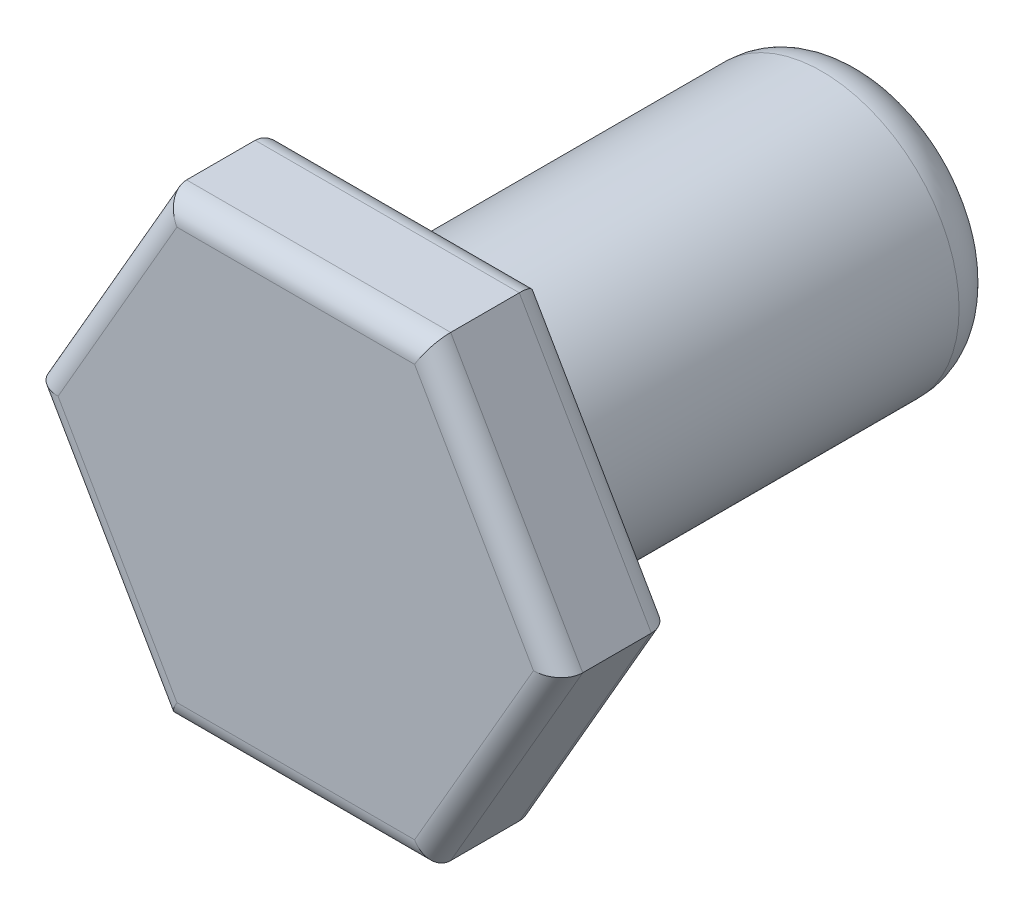
ISO-10303-21;
HEADER;
FILE_DESCRIPTION(('STEP AP214'),'2;1');
FILE_NAME('part.step','',(''),(''),'','','');
FILE_SCHEMA(('AUTOMOTIVE_DESIGN { 1 0 10303 214 1 1 1 1 }'));
ENDSEC;
DATA;
#1=APPLICATION_CONTEXT('core data for automotive mechanical design processes');
#2=APPLICATION_PROTOCOL_DEFINITION('international standard','automotive_design',2000,#1);
#3=PRODUCT_CONTEXT('',#1,'mechanical');
#4=PRODUCT('Part','Part','',(#3));
#5=PRODUCT_RELATED_PRODUCT_CATEGORY('part','',(#4));
#6=PRODUCT_DEFINITION_FORMATION('','',#4);
#7=PRODUCT_DEFINITION_CONTEXT('part definition',#1,'design');
#8=PRODUCT_DEFINITION('design','',#6,#7);
#9=PRODUCT_DEFINITION_SHAPE('','',#8);
#10=(LENGTH_UNIT() NAMED_UNIT(*) SI_UNIT(.MILLI.,.METRE.));
#11=(NAMED_UNIT(*) PLANE_ANGLE_UNIT() SI_UNIT($,.RADIAN.));
#12=(NAMED_UNIT(*) SI_UNIT($,.STERADIAN.) SOLID_ANGLE_UNIT());
#13=UNCERTAINTY_MEASURE_WITH_UNIT(LENGTH_MEASURE(1.E-05),#10,'distance_accuracy_value','');
#14=(GEOMETRIC_REPRESENTATION_CONTEXT(3) GLOBAL_UNCERTAINTY_ASSIGNED_CONTEXT((#13)) GLOBAL_UNIT_ASSIGNED_CONTEXT((#10,
#11,#12)) REPRESENTATION_CONTEXT('',''));
#15=CARTESIAN_POINT('',(0.,0.,0.));
#16=DIRECTION('',(0.,0.,1.));
#17=DIRECTION('',(1.,0.,0.));
#18=AXIS2_PLACEMENT_3D('',#15,#16,#17);
#19=CARTESIAN_POINT('',(0.,0.,20.));
#20=DIRECTION('',(0.,0.,-1.));
#21=DIRECTION('',(-1.,0.,0.));
#22=AXIS2_PLACEMENT_3D('',#19,#20,#21);
#23=CYLINDRICAL_SURFACE('',#22,6.);
#24=CARTESIAN_POINT('',(0.,0.,2.));
#25=DIRECTION('',(0.,0.,1.));
#26=DIRECTION('',(1.,0.,0.));
#27=AXIS2_PLACEMENT_3D('',#24,#25,#26);
#28=CIRCLE('',#27,6.);
#29=CARTESIAN_POINT('',(6.,0.,2.));
#30=VERTEX_POINT('',#29);
#31=EDGE_CURVE('E153',#30,#30,#28,.T.);
#32=ORIENTED_EDGE('',*,*,#31,.T.);
#33=EDGE_LOOP('',(#32));
#34=FACE_BOUND('',#33,.T.);
#35=CARTESIAN_POINT('',(0.,0.,20.));
#36=DIRECTION('',(0.,0.,1.));
#37=DIRECTION('',(1.,0.,0.));
#38=AXIS2_PLACEMENT_3D('',#35,#36,#37);
#39=CIRCLE('',#38,6.);
#40=CARTESIAN_POINT('',(6.,0.,20.));
#41=VERTEX_POINT('',#40);
#42=EDGE_CURVE('E258',#41,#41,#39,.T.);
#43=ORIENTED_EDGE('',*,*,#42,.F.);
#44=EDGE_LOOP('',(#43));
#45=FACE_BOUND('',#44,.T.);
#46=ADVANCED_FACE('F34',(#34,#45),#23,.T.);
#47=CARTESIAN_POINT('',(0.,0.,0.));
#48=DIRECTION('',(0.,0.,1.));
#49=DIRECTION('',(1.,0.,0.));
#50=AXIS2_PLACEMENT_3D('',#47,#48,#49);
#51=PLANE('',#50);
#52=CARTESIAN_POINT('',(0.,0.,0.));
#53=DIRECTION('',(0.,0.,1.));
#54=DIRECTION('',(1.,0.,0.));
#55=AXIS2_PLACEMENT_3D('',#52,#53,#54);
#56=CIRCLE('',#55,4.);
#57=CARTESIAN_POINT('',(4.,0.,0.));
#58=VERTEX_POINT('',#57);
#59=EDGE_CURVE('E150',#58,#58,#56,.F.);
#60=ORIENTED_EDGE('',*,*,#59,.T.);
#61=EDGE_LOOP('',(#60));
#62=FACE_BOUND('',#61,.T.);
#63=ADVANCED_FACE('F285',(#62),#51,.F.);
#64=CARTESIAN_POINT('',(0.,0.,20.));
#65=DIRECTION('',(0.,0.,1.));
#66=DIRECTION('',(1.,0.,0.));
#67=AXIS2_PLACEMENT_3D('',#64,#65,#66);
#68=PLANE('',#67);
#69=DIRECTION('',(-1.,0.,0.));
#70=VECTOR('',#69,1.);
#71=CARTESIAN_POINT('',(0.,9.,20.));
#72=LINE('',#71,#70);
#73=CARTESIAN_POINT('',(-5.19615242270663,9.,20.));
#74=VERTEX_POINT('',#73);
#75=CARTESIAN_POINT('',(5.19615242270663,9.,20.));
#76=VERTEX_POINT('',#75);
#77=EDGE_CURVE('E182',#74,#76,#72,.F.);
#78=ORIENTED_EDGE('',*,*,#77,.T.);
#79=DIRECTION('',(-0.5,0.866025403784438,0.));
#80=VECTOR('',#79,1.);
#81=CARTESIAN_POINT('',(7.79422863405995,4.5,20.));
#82=LINE('',#81,#80);
#83=CARTESIAN_POINT('',(10.3923048454133,0.,20.));
#84=VERTEX_POINT('',#83);
#85=EDGE_CURVE('E188',#76,#84,#82,.F.);
#86=ORIENTED_EDGE('',*,*,#85,.T.);
#87=DIRECTION('',(0.5,0.866025403784439,0.));
#88=VECTOR('',#87,1.);
#89=CARTESIAN_POINT('',(7.79422863405995,-4.5,20.));
#90=LINE('',#89,#88);
#91=CARTESIAN_POINT('',(5.19615242270663,-9.,20.));
#92=VERTEX_POINT('',#91);
#93=EDGE_CURVE('E186',#84,#92,#90,.F.);
#94=ORIENTED_EDGE('',*,*,#93,.T.);
#95=DIRECTION('',(1.,0.,0.));
#96=VECTOR('',#95,1.);
#97=CARTESIAN_POINT('',(0.,-9.,20.));
#98=LINE('',#97,#96);
#99=CARTESIAN_POINT('',(-5.19615242270663,-9.,20.));
#100=VERTEX_POINT('',#99);
#101=EDGE_CURVE('E184',#92,#100,#98,.F.);
#102=ORIENTED_EDGE('',*,*,#101,.T.);
#103=DIRECTION('',(0.5,-0.866025403784439,0.));
#104=VECTOR('',#103,1.);
#105=CARTESIAN_POINT('',(-7.79422863405994,-4.5,20.));
#106=LINE('',#105,#104);
#107=CARTESIAN_POINT('',(-10.3923048454133,0.,20.));
#108=VERTEX_POINT('',#107);
#109=EDGE_CURVE('E178',#100,#108,#106,.F.);
#110=ORIENTED_EDGE('',*,*,#109,.T.);
#111=DIRECTION('',(-0.5,-0.866025403784439,0.));
#112=VECTOR('',#111,1.);
#113=CARTESIAN_POINT('',(-7.79422863405995,4.5,20.));
#114=LINE('',#113,#112);
#115=EDGE_CURVE('E180',#108,#74,#114,.F.);
#116=ORIENTED_EDGE('',*,*,#115,.T.);
#117=EDGE_LOOP('',(#78,#86,#94,#102,#110,#116));
#118=FACE_BOUND('',#117,.T.);
#119=ORIENTED_EDGE('',*,*,#42,.T.);
#120=EDGE_LOOP('',(#119));
#121=FACE_BOUND('',#120,.T.);
#122=ADVANCED_FACE('F232',(#118,#121),#68,.F.);
#123=CARTESIAN_POINT('',(-5.77350269189626,-10.,25.));
#124=DIRECTION('',(0.,1.,0.));
#125=DIRECTION('',(0.,0.,1.));
#126=AXIS2_PLACEMENT_3D('',#123,#124,#125);
#127=PLANE('',#126);
#128=DIRECTION('',(0.,0.,-1.));
#129=VECTOR('',#128,1.);
#130=CARTESIAN_POINT('',(5.77350269189626,-10.,25.));
#131=LINE('',#130,#129);
#132=CARTESIAN_POINT('',(5.77350269189626,-10.,24.));
#133=VERTEX_POINT('',#132);
#134=CARTESIAN_POINT('',(5.77350269189626,-10.,21.));
#135=VERTEX_POINT('',#134);
#136=EDGE_CURVE('E250',#133,#135,#131,.T.);
#137=ORIENTED_EDGE('',*,*,#136,.F.);
#138=DIRECTION('',(1.,0.,0.));
#139=VECTOR('',#138,1.);
#140=CARTESIAN_POINT('',(-5.77350269189626,-10.,24.));
#141=LINE('',#140,#139);
#142=CARTESIAN_POINT('',(-5.77350269189626,-10.,24.));
#143=VERTEX_POINT('',#142);
#144=EDGE_CURVE('E193',#133,#143,#141,.F.);
#145=ORIENTED_EDGE('',*,*,#144,.T.);
#146=DIRECTION('',(0.,0.,-1.));
#147=VECTOR('',#146,1.);
#148=CARTESIAN_POINT('',(-5.77350269189626,-10.,25.));
#149=LINE('',#148,#147);
#150=CARTESIAN_POINT('',(-5.77350269189626,-10.,21.));
#151=VERTEX_POINT('',#150);
#152=EDGE_CURVE('E143',#143,#151,#149,.T.);
#153=ORIENTED_EDGE('',*,*,#152,.T.);
#154=DIRECTION('',(1.,0.,0.));
#155=VECTOR('',#154,1.);
#156=CARTESIAN_POINT('',(-5.77350269189626,-10.,21.));
#157=LINE('',#156,#155);
#158=EDGE_CURVE('E191',#151,#135,#157,.T.);
#159=ORIENTED_EDGE('',*,*,#158,.T.);
#160=EDGE_LOOP('',(#137,#145,#153,#159));
#161=FACE_BOUND('',#160,.T.);
#162=ADVANCED_FACE('F292',(#161),#127,.F.);
#163=CARTESIAN_POINT('',(5.77350269189626,-10.,25.));
#164=DIRECTION('',(-0.866025403784439,0.5,0.));
#165=DIRECTION('',(-0.5,-0.866025403784439,0.));
#166=AXIS2_PLACEMENT_3D('',#163,#164,#165);
#167=PLANE('',#166);
#168=DIRECTION('',(0.,0.,-1.));
#169=VECTOR('',#168,1.);
#170=CARTESIAN_POINT('',(11.5470053837925,0.,25.));
#171=LINE('',#170,#169);
#172=CARTESIAN_POINT('',(11.5470053837925,0.,24.));
#173=VERTEX_POINT('',#172);
#174=CARTESIAN_POINT('',(11.5470053837925,0.,21.));
#175=VERTEX_POINT('',#174);
#176=EDGE_CURVE('E247',#173,#175,#171,.T.);
#177=ORIENTED_EDGE('',*,*,#176,.F.);
#178=DIRECTION('',(0.5,0.866025403784439,0.));
#179=VECTOR('',#178,1.);
#180=CARTESIAN_POINT('',(5.77350269189626,-10.,24.));
#181=LINE('',#180,#179);
#182=EDGE_CURVE('E166',#173,#133,#181,.F.);
#183=ORIENTED_EDGE('',*,*,#182,.T.);
#184=ORIENTED_EDGE('',*,*,#136,.T.);
#185=DIRECTION('',(0.5,0.866025403784439,0.));
#186=VECTOR('',#185,1.);
#187=CARTESIAN_POINT('',(5.77350269189626,-10.,21.));
#188=LINE('',#187,#186);
#189=EDGE_CURVE('E164',#135,#175,#188,.T.);
#190=ORIENTED_EDGE('',*,*,#189,.T.);
#191=EDGE_LOOP('',(#177,#183,#184,#190));
#192=FACE_BOUND('',#191,.T.);
#193=ADVANCED_FACE('F246',(#192),#167,.F.);
#194=CARTESIAN_POINT('',(11.5470053837925,0.,25.));
#195=DIRECTION('',(-0.866025403784438,-0.5,0.));
#196=DIRECTION('',(0.5,-0.866025403784438,0.));
#197=AXIS2_PLACEMENT_3D('',#194,#195,#196);
#198=PLANE('',#197);
#199=DIRECTION('',(0.,0.,-1.));
#200=VECTOR('',#199,1.);
#201=CARTESIAN_POINT('',(5.77350269189625,10.,25.));
#202=LINE('',#201,#200);
#203=CARTESIAN_POINT('',(5.77350269189625,10.,24.));
#204=VERTEX_POINT('',#203);
#205=CARTESIAN_POINT('',(5.77350269189625,10.,21.));
#206=VERTEX_POINT('',#205);
#207=EDGE_CURVE('E256',#204,#206,#202,.T.);
#208=ORIENTED_EDGE('',*,*,#207,.F.);
#209=DIRECTION('',(-0.5,0.866025403784438,0.));
#210=VECTOR('',#209,1.);
#211=CARTESIAN_POINT('',(11.5470053837925,0.,24.));
#212=LINE('',#211,#210);
#213=EDGE_CURVE('E172',#204,#173,#212,.F.);
#214=ORIENTED_EDGE('',*,*,#213,.T.);
#215=ORIENTED_EDGE('',*,*,#176,.T.);
#216=DIRECTION('',(-0.5,0.866025403784438,0.));
#217=VECTOR('',#216,1.);
#218=CARTESIAN_POINT('',(11.5470053837925,0.,21.));
#219=LINE('',#218,#217);
#220=EDGE_CURVE('E169',#175,#206,#219,.T.);
#221=ORIENTED_EDGE('',*,*,#220,.T.);
#222=EDGE_LOOP('',(#208,#214,#215,#221));
#223=FACE_BOUND('',#222,.T.);
#224=ADVANCED_FACE('F253',(#223),#198,.F.);
#225=CARTESIAN_POINT('',(5.77350269189625,10.,25.));
#226=DIRECTION('',(0.,-1.,0.));
#227=DIRECTION('',(1.,0.,0.));
#228=AXIS2_PLACEMENT_3D('',#225,#226,#227);
#229=PLANE('',#228);
#230=DIRECTION('',(0.,0.,-1.));
#231=VECTOR('',#230,1.);
#232=CARTESIAN_POINT('',(-5.77350269189626,10.,25.));
#233=LINE('',#232,#231);
#234=CARTESIAN_POINT('',(-5.77350269189626,10.,24.));
#235=VERTEX_POINT('',#234);
#236=CARTESIAN_POINT('',(-5.77350269189626,10.,21.));
#237=VERTEX_POINT('',#236);
#238=EDGE_CURVE('E260',#235,#237,#233,.T.);
#239=ORIENTED_EDGE('',*,*,#238,.F.);
#240=DIRECTION('',(-1.,0.,0.));
#241=VECTOR('',#240,1.);
#242=CARTESIAN_POINT('',(5.77350269189625,10.,24.));
#243=LINE('',#242,#241);
#244=EDGE_CURVE('E176',#235,#204,#243,.F.);
#245=ORIENTED_EDGE('',*,*,#244,.T.);
#246=ORIENTED_EDGE('',*,*,#207,.T.);
#247=DIRECTION('',(-1.,0.,0.));
#248=VECTOR('',#247,1.);
#249=CARTESIAN_POINT('',(5.77350269189625,10.,21.));
#250=LINE('',#249,#248);
#251=EDGE_CURVE('E174',#206,#237,#250,.T.);
#252=ORIENTED_EDGE('',*,*,#251,.T.);
#253=EDGE_LOOP('',(#239,#245,#246,#252));
#254=FACE_BOUND('',#253,.T.);
#255=ADVANCED_FACE('F300',(#254),#229,.F.);
#256=CARTESIAN_POINT('',(-5.77350269189626,10.,25.));
#257=DIRECTION('',(0.866025403784439,-0.5,0.));
#258=DIRECTION('',(0.5,0.866025403784439,0.));
#259=AXIS2_PLACEMENT_3D('',#256,#257,#258);
#260=PLANE('',#259);
#261=ORIENTED_EDGE('',*,*,#238,.T.);
#262=DIRECTION('',(-0.5,-0.866025403784439,0.));
#263=VECTOR('',#262,1.);
#264=CARTESIAN_POINT('',(-5.77350269189626,10.,21.));
#265=LINE('',#264,#263);
#266=CARTESIAN_POINT('',(-11.5470053837925,0.,21.));
#267=VERTEX_POINT('',#266);
#268=EDGE_CURVE('E51',#237,#267,#265,.T.);
#269=ORIENTED_EDGE('',*,*,#268,.T.);
#270=DIRECTION('',(0.,0.,-1.));
#271=VECTOR('',#270,1.);
#272=CARTESIAN_POINT('',(-11.5470053837925,0.,25.));
#273=LINE('',#272,#271);
#274=CARTESIAN_POINT('',(-11.5470053837925,0.,24.));
#275=VERTEX_POINT('',#274);
#276=EDGE_CURVE('E455',#275,#267,#273,.T.);
#277=ORIENTED_EDGE('',*,*,#276,.F.);
#278=DIRECTION('',(-0.5,-0.866025403784439,0.));
#279=VECTOR('',#278,1.);
#280=CARTESIAN_POINT('',(-5.77350269189626,10.,24.));
#281=LINE('',#280,#279);
#282=EDGE_CURVE('E141',#275,#235,#281,.F.);
#283=ORIENTED_EDGE('',*,*,#282,.T.);
#284=EDGE_LOOP('',(#261,#269,#277,#283));
#285=FACE_BOUND('',#284,.T.);
#286=ADVANCED_FACE('F303',(#285),#260,.F.);
#287=CARTESIAN_POINT('',(-11.5470053837925,0.,25.));
#288=DIRECTION('',(0.866025403784438,0.5,0.));
#289=DIRECTION('',(-0.5,0.866025403784439,0.));
#290=AXIS2_PLACEMENT_3D('',#287,#288,#289);
#291=PLANE('',#290);
#292=ORIENTED_EDGE('',*,*,#152,.F.);
#293=DIRECTION('',(0.5,-0.866025403784439,0.));
#294=VECTOR('',#293,1.);
#295=CARTESIAN_POINT('',(-11.5470053837925,0.,24.));
#296=LINE('',#295,#294);
#297=EDGE_CURVE('E11',#143,#275,#296,.F.);
#298=ORIENTED_EDGE('',*,*,#297,.T.);
#299=ORIENTED_EDGE('',*,*,#276,.T.);
#300=DIRECTION('',(0.5,-0.866025403784439,0.));
#301=VECTOR('',#300,1.);
#302=CARTESIAN_POINT('',(-11.5470053837925,0.,21.));
#303=LINE('',#302,#301);
#304=EDGE_CURVE('E43',#267,#151,#303,.T.);
#305=ORIENTED_EDGE('',*,*,#304,.T.);
#306=EDGE_LOOP('',(#292,#298,#299,#305));
#307=FACE_BOUND('',#306,.T.);
#308=ADVANCED_FACE('F279',(#307),#291,.F.);
#309=CARTESIAN_POINT('',(0.,0.,25.));
#310=DIRECTION('',(0.,0.,1.));
#311=DIRECTION('',(1.,0.,0.));
#312=AXIS2_PLACEMENT_3D('',#309,#310,#311);
#313=PLANE('',#312);
#314=DIRECTION('',(1.,0.,0.));
#315=VECTOR('',#314,1.);
#316=CARTESIAN_POINT('',(5.77350269189626,-9.,25.));
#317=LINE('',#316,#315);
#318=CARTESIAN_POINT('',(-5.19615242270663,-9.,25.));
#319=VERTEX_POINT('',#318);
#320=CARTESIAN_POINT('',(5.19615242270663,-9.,25.));
#321=VERTEX_POINT('',#320);
#322=EDGE_CURVE('E135',#319,#321,#317,.T.);
#323=ORIENTED_EDGE('',*,*,#322,.T.);
#324=DIRECTION('',(0.5,0.866025403784439,0.));
#325=VECTOR('',#324,1.);
#326=CARTESIAN_POINT('',(10.6809799800081,0.500000000000005,25.));
#327=LINE('',#326,#325);
#328=CARTESIAN_POINT('',(10.3923048454133,0.,25.));
#329=VERTEX_POINT('',#328);
#330=EDGE_CURVE('E161',#321,#329,#327,.T.);
#331=ORIENTED_EDGE('',*,*,#330,.T.);
#332=DIRECTION('',(-0.5,0.866025403784438,0.));
#333=VECTOR('',#332,1.);
#334=CARTESIAN_POINT('',(4.90747728811182,9.5,25.));
#335=LINE('',#334,#333);
#336=CARTESIAN_POINT('',(5.19615242270663,9.,25.));
#337=VERTEX_POINT('',#336);
#338=EDGE_CURVE('E159',#329,#337,#335,.T.);
#339=ORIENTED_EDGE('',*,*,#338,.T.);
#340=DIRECTION('',(-1.,0.,0.));
#341=VECTOR('',#340,1.);
#342=CARTESIAN_POINT('',(-5.77350269189626,9.,25.));
#343=LINE('',#342,#341);
#344=CARTESIAN_POINT('',(-5.19615242270663,9.,25.));
#345=VERTEX_POINT('',#344);
#346=EDGE_CURVE('E131',#337,#345,#343,.T.);
#347=ORIENTED_EDGE('',*,*,#346,.T.);
#348=DIRECTION('',(-0.5,-0.866025403784439,0.));
#349=VECTOR('',#348,1.);
#350=CARTESIAN_POINT('',(-10.6809799800081,-0.499999999999999,25.));
#351=LINE('',#350,#349);
#352=CARTESIAN_POINT('',(-10.3923048454133,0.,25.));
#353=VERTEX_POINT('',#352);
#354=EDGE_CURVE('E124',#345,#353,#351,.T.);
#355=ORIENTED_EDGE('',*,*,#354,.T.);
#356=DIRECTION('',(0.5,-0.866025403784439,0.));
#357=VECTOR('',#356,1.);
#358=CARTESIAN_POINT('',(-4.90747728811181,-9.5,25.));
#359=LINE('',#358,#357);
#360=EDGE_CURVE('E128',#353,#319,#359,.T.);
#361=ORIENTED_EDGE('',*,*,#360,.T.);
#362=EDGE_LOOP('',(#323,#331,#339,#347,#355,#361));
#363=FACE_BOUND('',#362,.T.);
#364=ADVANCED_FACE('F126',(#363),#313,.T.);
#365=CARTESIAN_POINT('',(0.,0.,2.));
#366=DIRECTION('',(0.,0.,1.));
#367=DIRECTION('',(1.,0.,0.));
#368=AXIS2_PLACEMENT_3D('',#365,#366,#367);
#369=TOROIDAL_SURFACE('',#368,4.,2.);
#370=ORIENTED_EDGE('',*,*,#59,.F.);
#371=EDGE_LOOP('',(#370));
#372=FACE_BOUND('',#371,.T.);
#373=ORIENTED_EDGE('',*,*,#31,.F.);
#374=EDGE_LOOP('',(#373));
#375=FACE_BOUND('',#374,.T.);
#376=ADVANCED_FACE('F270',(#372,#375),#369,.T.);
#377=CARTESIAN_POINT('',(-7.79422863405995,4.5,24.));
#378=DIRECTION('',(0.5,0.866025403784439,0.));
#379=DIRECTION('',(-0.866025403784439,0.5,0.));
#380=AXIS2_PLACEMENT_3D('',#377,#378,#379);
#381=CYLINDRICAL_SURFACE('',#380,1.);
#382=CARTESIAN_POINT('',(-5.19615242270663,9.,24.));
#383=DIRECTION('',(0.866025403784439,0.5,0.));
#384=DIRECTION('',(-0.5,0.866025403784439,0.));
#385=AXIS2_PLACEMENT_3D('',#382,#383,#384);
#386=ELLIPSE('',#385,1.15470053837925,1.);
#387=EDGE_CURVE('E144',#235,#345,#386,.T.);
#388=ORIENTED_EDGE('',*,*,#387,.F.);
#389=ORIENTED_EDGE('',*,*,#282,.F.);
#390=CARTESIAN_POINT('',(-10.3923048454133,0.,24.));
#391=DIRECTION('',(0.,1.,0.));
#392=DIRECTION('',(-1.,0.,0.));
#393=AXIS2_PLACEMENT_3D('',#390,#391,#392);
#394=ELLIPSE('',#393,1.15470053837925,1.);
#395=EDGE_CURVE('E139',#353,#275,#394,.F.);
#396=ORIENTED_EDGE('',*,*,#395,.F.);
#397=ORIENTED_EDGE('',*,*,#354,.F.);
#398=EDGE_LOOP('',(#388,#389,#396,#397));
#399=FACE_BOUND('',#398,.T.);
#400=ADVANCED_FACE('F140',(#399),#381,.T.);
#401=CARTESIAN_POINT('',(-7.79422863405994,-4.5,24.));
#402=DIRECTION('',(-0.5,0.866025403784439,0.));
#403=DIRECTION('',(-0.866025403784438,-0.5,0.));
#404=AXIS2_PLACEMENT_3D('',#401,#402,#403);
#405=CYLINDRICAL_SURFACE('',#404,1.);
#406=ORIENTED_EDGE('',*,*,#395,.T.);
#407=ORIENTED_EDGE('',*,*,#297,.F.);
#408=CARTESIAN_POINT('',(-5.19615242270663,-9.,24.));
#409=DIRECTION('',(-0.866025403784439,0.5,0.));
#410=DIRECTION('',(0.5,0.866025403784439,0.));
#411=AXIS2_PLACEMENT_3D('',#408,#409,#410);
#412=ELLIPSE('',#411,1.15470053837925,1.);
#413=EDGE_CURVE('E148',#319,#143,#412,.F.);
#414=ORIENTED_EDGE('',*,*,#413,.F.);
#415=ORIENTED_EDGE('',*,*,#360,.F.);
#416=EDGE_LOOP('',(#406,#407,#414,#415));
#417=FACE_BOUND('',#416,.T.);
#418=ADVANCED_FACE('F146',(#417),#405,.T.);
#419=CARTESIAN_POINT('',(0.,9.,24.));
#420=DIRECTION('',(1.,0.,0.));
#421=DIRECTION('',(0.,1.,0.));
#422=AXIS2_PLACEMENT_3D('',#419,#420,#421);
#423=CYLINDRICAL_SURFACE('',#422,1.);
#424=ORIENTED_EDGE('',*,*,#387,.T.);
#425=ORIENTED_EDGE('',*,*,#346,.F.);
#426=CARTESIAN_POINT('',(5.19615242270663,9.,24.));
#427=DIRECTION('',(0.866025403784439,-0.5,0.));
#428=DIRECTION('',(0.5,0.866025403784439,0.));
#429=AXIS2_PLACEMENT_3D('',#426,#427,#428);
#430=ELLIPSE('',#429,1.15470053837925,1.);
#431=EDGE_CURVE('E202',#204,#337,#430,.T.);
#432=ORIENTED_EDGE('',*,*,#431,.F.);
#433=ORIENTED_EDGE('',*,*,#244,.F.);
#434=EDGE_LOOP('',(#424,#425,#432,#433));
#435=FACE_BOUND('',#434,.T.);
#436=ADVANCED_FACE('F358',(#435),#423,.T.);
#437=CARTESIAN_POINT('',(0.,-9.,24.));
#438=DIRECTION('',(-1.,0.,0.));
#439=DIRECTION('',(0.,0.,1.));
#440=AXIS2_PLACEMENT_3D('',#437,#438,#439);
#441=CYLINDRICAL_SURFACE('',#440,1.);
#442=ORIENTED_EDGE('',*,*,#413,.T.);
#443=ORIENTED_EDGE('',*,*,#144,.F.);
#444=CARTESIAN_POINT('',(5.19615242270663,-9.,24.));
#445=DIRECTION('',(-0.866025403784439,-0.5,0.));
#446=DIRECTION('',(-0.5,0.866025403784439,0.));
#447=AXIS2_PLACEMENT_3D('',#444,#445,#446);
#448=ELLIPSE('',#447,1.15470053837925,1.);
#449=EDGE_CURVE('E200',#321,#133,#448,.F.);
#450=ORIENTED_EDGE('',*,*,#449,.F.);
#451=ORIENTED_EDGE('',*,*,#322,.F.);
#452=EDGE_LOOP('',(#442,#443,#450,#451));
#453=FACE_BOUND('',#452,.T.);
#454=ADVANCED_FACE('F367',(#453),#441,.T.);
#455=CARTESIAN_POINT('',(7.79422863405995,4.5,24.));
#456=DIRECTION('',(0.5,-0.866025403784438,0.));
#457=DIRECTION('',(0.866025403784438,0.5,0.));
#458=AXIS2_PLACEMENT_3D('',#455,#456,#457);
#459=CYLINDRICAL_SURFACE('',#458,1.);
#460=ORIENTED_EDGE('',*,*,#431,.T.);
#461=ORIENTED_EDGE('',*,*,#338,.F.);
#462=CARTESIAN_POINT('',(10.3923048454133,0.,24.));
#463=DIRECTION('',(0.,-1.,0.));
#464=DIRECTION('',(1.,0.,0.));
#465=AXIS2_PLACEMENT_3D('',#462,#463,#464);
#466=ELLIPSE('',#465,1.15470053837925,1.);
#467=EDGE_CURVE('E198',#173,#329,#466,.T.);
#468=ORIENTED_EDGE('',*,*,#467,.F.);
#469=ORIENTED_EDGE('',*,*,#213,.F.);
#470=EDGE_LOOP('',(#460,#461,#468,#469));
#471=FACE_BOUND('',#470,.T.);
#472=ADVANCED_FACE('F377',(#471),#459,.T.);
#473=CARTESIAN_POINT('',(7.79422863405995,-4.5,24.));
#474=DIRECTION('',(-0.5,-0.866025403784439,0.));
#475=DIRECTION('',(0.866025403784439,-0.5,0.));
#476=AXIS2_PLACEMENT_3D('',#473,#474,#475);
#477=CYLINDRICAL_SURFACE('',#476,1.);
#478=ORIENTED_EDGE('',*,*,#449,.T.);
#479=ORIENTED_EDGE('',*,*,#182,.F.);
#480=ORIENTED_EDGE('',*,*,#467,.T.);
#481=ORIENTED_EDGE('',*,*,#330,.F.);
#482=EDGE_LOOP('',(#478,#479,#480,#481));
#483=FACE_BOUND('',#482,.T.);
#484=ADVANCED_FACE('F387',(#483),#477,.T.);
#485=CARTESIAN_POINT('',(-10.6809799800081,0.500000000000002,21.));
#486=DIRECTION('',(0.5,-0.866025403784439,0.));
#487=DIRECTION('',(0.866025403784438,0.5,0.));
#488=AXIS2_PLACEMENT_3D('',#485,#486,#487);
#489=CYLINDRICAL_SURFACE('',#488,1.);
#490=CARTESIAN_POINT('',(-10.3923048454133,0.,21.));
#491=DIRECTION('',(0.,-1.,0.));
#492=DIRECTION('',(1.,0.,0.));
#493=AXIS2_PLACEMENT_3D('',#490,#491,#492);
#494=ELLIPSE('',#493,1.15470053837925,1.);
#495=EDGE_CURVE('E216',#108,#267,#494,.F.);
#496=ORIENTED_EDGE('',*,*,#495,.F.);
#497=ORIENTED_EDGE('',*,*,#109,.F.);
#498=CARTESIAN_POINT('',(-5.19615242270663,-9.,21.));
#499=DIRECTION('',(0.866025403784439,-0.5,0.));
#500=DIRECTION('',(-0.5,-0.866025403784439,0.));
#501=AXIS2_PLACEMENT_3D('',#498,#499,#500);
#502=ELLIPSE('',#501,1.15470053837925,1.);
#503=EDGE_CURVE('E38',#151,#100,#502,.T.);
#504=ORIENTED_EDGE('',*,*,#503,.F.);
#505=ORIENTED_EDGE('',*,*,#304,.F.);
#506=EDGE_LOOP('',(#496,#497,#504,#505));
#507=FACE_BOUND('',#506,.T.);
#508=ADVANCED_FACE('F36',(#507),#489,.T.);
#509=CARTESIAN_POINT('',(-5.77350269189626,-9.,21.));
#510=DIRECTION('',(1.,0.,0.));
#511=DIRECTION('',(0.,0.,-1.));
#512=AXIS2_PLACEMENT_3D('',#509,#510,#511);
#513=CYLINDRICAL_SURFACE('',#512,1.);
#514=ORIENTED_EDGE('',*,*,#503,.T.);
#515=ORIENTED_EDGE('',*,*,#101,.F.);
#516=CARTESIAN_POINT('',(5.19615242270663,-9.,21.));
#517=DIRECTION('',(0.866025403784439,0.5,0.));
#518=DIRECTION('',(0.5,-0.866025403784439,0.));
#519=AXIS2_PLACEMENT_3D('',#516,#517,#518);
#520=ELLIPSE('',#519,1.15470053837925,1.);
#521=EDGE_CURVE('E214',#135,#92,#520,.T.);
#522=ORIENTED_EDGE('',*,*,#521,.F.);
#523=ORIENTED_EDGE('',*,*,#158,.F.);
#524=EDGE_LOOP('',(#514,#515,#522,#523));
#525=FACE_BOUND('',#524,.T.);
#526=ADVANCED_FACE('F226',(#525),#513,.T.);
#527=CARTESIAN_POINT('',(-4.90747728811182,9.5,21.));
#528=DIRECTION('',(-0.5,-0.866025403784439,0.));
#529=DIRECTION('',(0.866025403784439,-0.5,0.));
#530=AXIS2_PLACEMENT_3D('',#527,#528,#529);
#531=CYLINDRICAL_SURFACE('',#530,1.);
#532=ORIENTED_EDGE('',*,*,#495,.T.);
#533=ORIENTED_EDGE('',*,*,#268,.F.);
#534=CARTESIAN_POINT('',(-5.19615242270663,9.,21.));
#535=DIRECTION('',(-0.866025403784439,-0.5,0.));
#536=DIRECTION('',(0.5,-0.866025403784439,0.));
#537=AXIS2_PLACEMENT_3D('',#534,#535,#536);
#538=ELLIPSE('',#537,1.15470053837925,1.);
#539=EDGE_CURVE('E211',#74,#237,#538,.F.);
#540=ORIENTED_EDGE('',*,*,#539,.F.);
#541=ORIENTED_EDGE('',*,*,#115,.F.);
#542=EDGE_LOOP('',(#532,#533,#540,#541));
#543=FACE_BOUND('',#542,.T.);
#544=ADVANCED_FACE('F412',(#543),#531,.T.);
#545=CARTESIAN_POINT('',(4.90747728811182,-9.5,21.));
#546=DIRECTION('',(0.5,0.866025403784439,0.));
#547=DIRECTION('',(-0.866025403784439,0.5,0.));
#548=AXIS2_PLACEMENT_3D('',#545,#546,#547);
#549=CYLINDRICAL_SURFACE('',#548,1.);
#550=ORIENTED_EDGE('',*,*,#521,.T.);
#551=ORIENTED_EDGE('',*,*,#93,.F.);
#552=CARTESIAN_POINT('',(10.3923048454133,0.,21.));
#553=DIRECTION('',(0.,1.,0.));
#554=DIRECTION('',(1.,0.,0.));
#555=AXIS2_PLACEMENT_3D('',#552,#553,#554);
#556=ELLIPSE('',#555,1.15470053837925,1.);
#557=EDGE_CURVE('E209',#175,#84,#556,.T.);
#558=ORIENTED_EDGE('',*,*,#557,.F.);
#559=ORIENTED_EDGE('',*,*,#189,.F.);
#560=EDGE_LOOP('',(#550,#551,#558,#559));
#561=FACE_BOUND('',#560,.T.);
#562=ADVANCED_FACE('F239',(#561),#549,.T.);
#563=CARTESIAN_POINT('',(5.77350269189625,9.,21.));
#564=DIRECTION('',(-1.,0.,0.));
#565=DIRECTION('',(0.,-1.,0.));
#566=AXIS2_PLACEMENT_3D('',#563,#564,#565);
#567=CYLINDRICAL_SURFACE('',#566,1.);
#568=ORIENTED_EDGE('',*,*,#539,.T.);
#569=ORIENTED_EDGE('',*,*,#251,.F.);
#570=CARTESIAN_POINT('',(5.19615242270663,9.,21.));
#571=DIRECTION('',(-0.866025403784439,0.5,0.));
#572=DIRECTION('',(-0.5,-0.866025403784439,0.));
#573=AXIS2_PLACEMENT_3D('',#570,#571,#572);
#574=ELLIPSE('',#573,1.15470053837925,1.);
#575=EDGE_CURVE('E207',#76,#206,#574,.F.);
#576=ORIENTED_EDGE('',*,*,#575,.F.);
#577=ORIENTED_EDGE('',*,*,#77,.F.);
#578=EDGE_LOOP('',(#568,#569,#576,#577));
#579=FACE_BOUND('',#578,.T.);
#580=ADVANCED_FACE('F428',(#579),#567,.T.);
#581=CARTESIAN_POINT('',(10.6809799800081,-0.499999999999998,21.));
#582=DIRECTION('',(-0.5,0.866025403784438,0.));
#583=DIRECTION('',(-0.866025403784438,-0.5,0.));
#584=AXIS2_PLACEMENT_3D('',#581,#582,#583);
#585=CYLINDRICAL_SURFACE('',#584,1.);
#586=ORIENTED_EDGE('',*,*,#557,.T.);
#587=ORIENTED_EDGE('',*,*,#85,.F.);
#588=ORIENTED_EDGE('',*,*,#575,.T.);
#589=ORIENTED_EDGE('',*,*,#220,.F.);
#590=EDGE_LOOP('',(#586,#587,#588,#589));
#591=FACE_BOUND('',#590,.T.);
#592=ADVANCED_FACE('F437',(#591),#585,.T.);
#593=CLOSED_SHELL('',(#46,#63,#122,#162,#193,#224,#255,#286,#308,#364,#376,#400,#418,#436,#454,
#472,#484,#508,#526,#544,#562,#580,#592));
#594=MANIFOLD_SOLID_BREP('B2',#593);
#595=ADVANCED_BREP_SHAPE_REPRESENTATION('',(#18,#594),#14);
#596=SHAPE_DEFINITION_REPRESENTATION(#9,#595);
ENDSEC;
END-ISO-10303-21;
